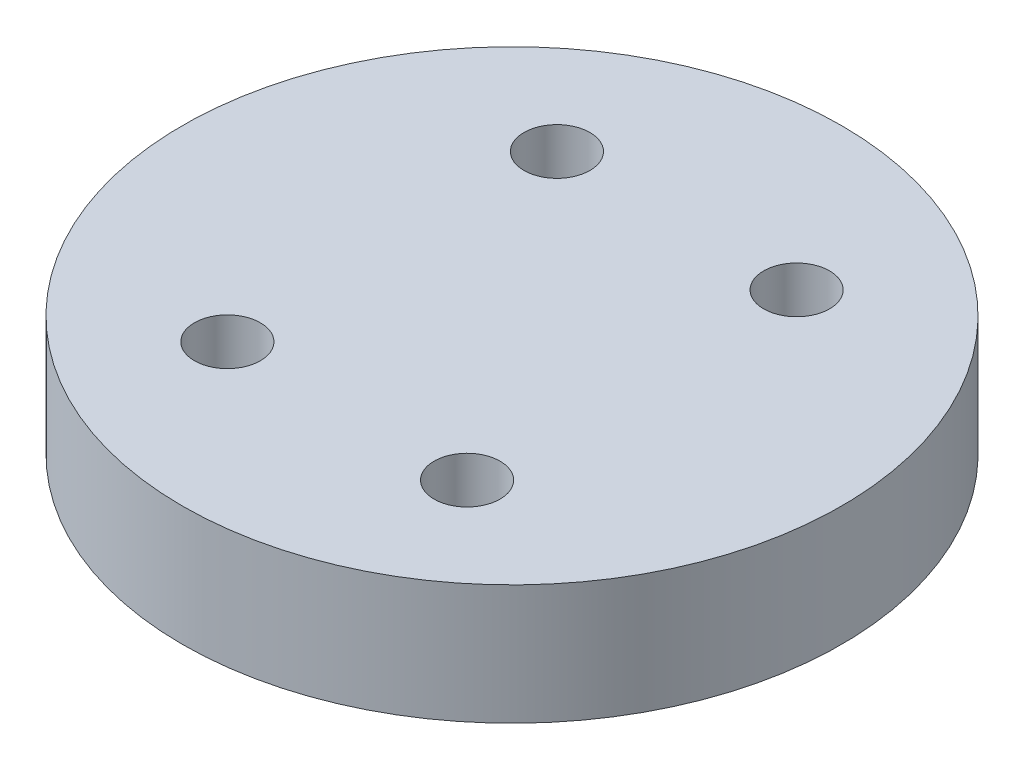
ISO-10303-21;
HEADER;
FILE_DESCRIPTION(('STEP AP214'),'2;1');
FILE_NAME('part.step','',(''),(''),'','','');
FILE_SCHEMA(('AUTOMOTIVE_DESIGN { 1 0 10303 214 1 1 1 1 }'));
ENDSEC;
DATA;
#1=APPLICATION_CONTEXT('core data for automotive mechanical design processes');
#2=APPLICATION_PROTOCOL_DEFINITION('international standard','automotive_design',2000,#1);
#3=PRODUCT_CONTEXT('',#1,'mechanical');
#4=PRODUCT('Part','Part','',(#3));
#5=PRODUCT_RELATED_PRODUCT_CATEGORY('part','',(#4));
#6=PRODUCT_DEFINITION_FORMATION('','',#4);
#7=PRODUCT_DEFINITION_CONTEXT('part definition',#1,'design');
#8=PRODUCT_DEFINITION('design','',#6,#7);
#9=PRODUCT_DEFINITION_SHAPE('','',#8);
#10=(LENGTH_UNIT() NAMED_UNIT(*) SI_UNIT(.MILLI.,.METRE.));
#11=(NAMED_UNIT(*) PLANE_ANGLE_UNIT() SI_UNIT($,.RADIAN.));
#12=(NAMED_UNIT(*) SI_UNIT($,.STERADIAN.) SOLID_ANGLE_UNIT());
#13=UNCERTAINTY_MEASURE_WITH_UNIT(LENGTH_MEASURE(1.E-05),#10,'distance_accuracy_value','');
#14=(GEOMETRIC_REPRESENTATION_CONTEXT(3) GLOBAL_UNCERTAINTY_ASSIGNED_CONTEXT((#13)) GLOBAL_UNIT_ASSIGNED_CONTEXT((#10,
#11,#12)) REPRESENTATION_CONTEXT('',''));
#15=CARTESIAN_POINT('',(0.,0.,0.));
#16=DIRECTION('',(0.,0.,1.));
#17=DIRECTION('',(1.,0.,0.));
#18=AXIS2_PLACEMENT_3D('',#15,#16,#17);
#19=CARTESIAN_POINT('',(10.,10.,13.75));
#20=DIRECTION('',(0.,-1.,0.));
#21=DIRECTION('',(0.,0.,-1.));
#22=AXIS2_PLACEMENT_3D('',#19,#20,#21);
#23=CYLINDRICAL_SURFACE('',#22,2.74999999999999);
#24=CARTESIAN_POINT('',(10.,10.,13.75));
#25=DIRECTION('',(0.,1.,0.));
#26=DIRECTION('',(0.,0.,1.));
#27=AXIS2_PLACEMENT_3D('',#24,#25,#26);
#28=CIRCLE('',#27,2.74999999999999);
#29=CARTESIAN_POINT('',(10.,10.,16.5));
#30=VERTEX_POINT('',#29);
#31=EDGE_CURVE('E43',#30,#30,#28,.T.);
#32=ORIENTED_EDGE('',*,*,#31,.T.);
#33=EDGE_LOOP('',(#32));
#34=FACE_BOUND('',#33,.T.);
#35=CARTESIAN_POINT('',(10.,0.,13.75));
#36=DIRECTION('',(0.,1.,0.));
#37=DIRECTION('',(0.,0.,1.));
#38=AXIS2_PLACEMENT_3D('',#35,#36,#37);
#39=CIRCLE('',#38,2.74999999999999);
#40=CARTESIAN_POINT('',(10.,0.,16.5));
#41=VERTEX_POINT('',#40);
#42=EDGE_CURVE('E60',#41,#41,#39,.T.);
#43=ORIENTED_EDGE('',*,*,#42,.F.);
#44=EDGE_LOOP('',(#43));
#45=FACE_BOUND('',#44,.T.);
#46=ADVANCED_FACE('F35',(#34,#45),#23,.F.);
#47=CARTESIAN_POINT('',(10.,10.,-13.75));
#48=DIRECTION('',(0.,-1.,0.));
#49=DIRECTION('',(0.,0.,-1.));
#50=AXIS2_PLACEMENT_3D('',#47,#48,#49);
#51=CYLINDRICAL_SURFACE('',#50,2.75);
#52=CARTESIAN_POINT('',(10.,10.,-13.75));
#53=DIRECTION('',(0.,1.,0.));
#54=DIRECTION('',(0.,0.,1.));
#55=AXIS2_PLACEMENT_3D('',#52,#53,#54);
#56=CIRCLE('',#55,2.75);
#57=CARTESIAN_POINT('',(10.,10.,-11.));
#58=VERTEX_POINT('',#57);
#59=EDGE_CURVE('E48',#58,#58,#56,.T.);
#60=ORIENTED_EDGE('',*,*,#59,.T.);
#61=EDGE_LOOP('',(#60));
#62=FACE_BOUND('',#61,.T.);
#63=CARTESIAN_POINT('',(10.,0.,-13.75));
#64=DIRECTION('',(0.,1.,0.));
#65=DIRECTION('',(0.,0.,1.));
#66=AXIS2_PLACEMENT_3D('',#63,#64,#65);
#67=CIRCLE('',#66,2.75);
#68=CARTESIAN_POINT('',(10.,0.,-11.));
#69=VERTEX_POINT('',#68);
#70=EDGE_CURVE('E58',#69,#69,#67,.T.);
#71=ORIENTED_EDGE('',*,*,#70,.F.);
#72=EDGE_LOOP('',(#71));
#73=FACE_BOUND('',#72,.T.);
#74=ADVANCED_FACE('F78',(#62,#73),#51,.F.);
#75=CARTESIAN_POINT('',(-10.,10.,13.75));
#76=DIRECTION('',(0.,-1.,0.));
#77=DIRECTION('',(0.,0.,-1.));
#78=AXIS2_PLACEMENT_3D('',#75,#76,#77);
#79=CYLINDRICAL_SURFACE('',#78,2.75);
#80=CARTESIAN_POINT('',(-10.,10.,13.75));
#81=DIRECTION('',(0.,1.,0.));
#82=DIRECTION('',(0.,0.,1.));
#83=AXIS2_PLACEMENT_3D('',#80,#81,#82);
#84=CIRCLE('',#83,2.75);
#85=CARTESIAN_POINT('',(-10.,10.,16.5));
#86=VERTEX_POINT('',#85);
#87=EDGE_CURVE('E69',#86,#86,#84,.T.);
#88=ORIENTED_EDGE('',*,*,#87,.T.);
#89=EDGE_LOOP('',(#88));
#90=FACE_BOUND('',#89,.T.);
#91=CARTESIAN_POINT('',(-10.,0.,13.75));
#92=DIRECTION('',(0.,1.,0.));
#93=DIRECTION('',(0.,0.,1.));
#94=AXIS2_PLACEMENT_3D('',#91,#92,#93);
#95=CIRCLE('',#94,2.75);
#96=CARTESIAN_POINT('',(-10.,0.,16.5));
#97=VERTEX_POINT('',#96);
#98=EDGE_CURVE('E55',#97,#97,#95,.T.);
#99=ORIENTED_EDGE('',*,*,#98,.F.);
#100=EDGE_LOOP('',(#99));
#101=FACE_BOUND('',#100,.T.);
#102=ADVANCED_FACE('F96',(#90,#101),#79,.F.);
#103=CARTESIAN_POINT('',(-10.,10.,-13.75));
#104=DIRECTION('',(0.,-1.,0.));
#105=DIRECTION('',(0.,0.,-1.));
#106=AXIS2_PLACEMENT_3D('',#103,#104,#105);
#107=CYLINDRICAL_SURFACE('',#106,2.75000000000001);
#108=CARTESIAN_POINT('',(-10.,10.,-13.75));
#109=DIRECTION('',(0.,1.,0.));
#110=DIRECTION('',(0.,0.,1.));
#111=AXIS2_PLACEMENT_3D('',#108,#109,#110);
#112=CIRCLE('',#111,2.75000000000001);
#113=CARTESIAN_POINT('',(-10.,10.,-11.));
#114=VERTEX_POINT('',#113);
#115=EDGE_CURVE('E65',#114,#114,#112,.T.);
#116=ORIENTED_EDGE('',*,*,#115,.T.);
#117=EDGE_LOOP('',(#116));
#118=FACE_BOUND('',#117,.T.);
#119=CARTESIAN_POINT('',(-10.,0.,-13.75));
#120=DIRECTION('',(0.,1.,0.));
#121=DIRECTION('',(0.,0.,1.));
#122=AXIS2_PLACEMENT_3D('',#119,#120,#121);
#123=CIRCLE('',#122,2.75000000000001);
#124=CARTESIAN_POINT('',(-10.,0.,-11.));
#125=VERTEX_POINT('',#124);
#126=EDGE_CURVE('E52',#125,#125,#123,.T.);
#127=ORIENTED_EDGE('',*,*,#126,.F.);
#128=EDGE_LOOP('',(#127));
#129=FACE_BOUND('',#128,.T.);
#130=ADVANCED_FACE('F37',(#118,#129),#107,.F.);
#131=CARTESIAN_POINT('',(0.,10.,0.));
#132=DIRECTION('',(0.,-1.,0.));
#133=DIRECTION('',(0.,0.,-1.));
#134=AXIS2_PLACEMENT_3D('',#131,#132,#133);
#135=CYLINDRICAL_SURFACE('',#134,27.5);
#136=CARTESIAN_POINT('',(0.,10.,0.));
#137=DIRECTION('',(0.,1.,0.));
#138=DIRECTION('',(0.,0.,1.));
#139=AXIS2_PLACEMENT_3D('',#136,#137,#138);
#140=CIRCLE('',#139,27.5);
#141=CARTESIAN_POINT('',(0.,10.,27.5));
#142=VERTEX_POINT('',#141);
#143=EDGE_CURVE('E10',#142,#142,#140,.T.);
#144=ORIENTED_EDGE('',*,*,#143,.F.);
#145=EDGE_LOOP('',(#144));
#146=FACE_BOUND('',#145,.T.);
#147=CARTESIAN_POINT('',(0.,0.,0.));
#148=DIRECTION('',(0.,1.,0.));
#149=DIRECTION('',(0.,0.,1.));
#150=AXIS2_PLACEMENT_3D('',#147,#148,#149);
#151=CIRCLE('',#150,27.5);
#152=CARTESIAN_POINT('',(0.,0.,27.5));
#153=VERTEX_POINT('',#152);
#154=EDGE_CURVE('E39',#153,#153,#151,.T.);
#155=ORIENTED_EDGE('',*,*,#154,.T.);
#156=EDGE_LOOP('',(#155));
#157=FACE_BOUND('',#156,.T.);
#158=ADVANCED_FACE('F85',(#146,#157),#135,.T.);
#159=CARTESIAN_POINT('',(0.,10.,0.));
#160=DIRECTION('',(0.,1.,0.));
#161=DIRECTION('',(0.,0.,1.));
#162=AXIS2_PLACEMENT_3D('',#159,#160,#161);
#163=PLANE('',#162);
#164=ORIENTED_EDGE('',*,*,#115,.F.);
#165=EDGE_LOOP('',(#164));
#166=FACE_BOUND('',#165,.T.);
#167=ORIENTED_EDGE('',*,*,#87,.F.);
#168=EDGE_LOOP('',(#167));
#169=FACE_BOUND('',#168,.T.);
#170=ORIENTED_EDGE('',*,*,#59,.F.);
#171=EDGE_LOOP('',(#170));
#172=FACE_BOUND('',#171,.T.);
#173=ORIENTED_EDGE('',*,*,#31,.F.);
#174=EDGE_LOOP('',(#173));
#175=FACE_BOUND('',#174,.T.);
#176=ORIENTED_EDGE('',*,*,#143,.T.);
#177=EDGE_LOOP('',(#176));
#178=FACE_BOUND('',#177,.T.);
#179=ADVANCED_FACE('F81',(#166,#169,#172,#175,#178),#163,.T.);
#180=CARTESIAN_POINT('',(0.,0.,0.));
#181=DIRECTION('',(0.,1.,0.));
#182=DIRECTION('',(0.,0.,1.));
#183=AXIS2_PLACEMENT_3D('',#180,#181,#182);
#184=PLANE('',#183);
#185=ORIENTED_EDGE('',*,*,#126,.T.);
#186=EDGE_LOOP('',(#185));
#187=FACE_BOUND('',#186,.T.);
#188=ORIENTED_EDGE('',*,*,#98,.T.);
#189=EDGE_LOOP('',(#188));
#190=FACE_BOUND('',#189,.T.);
#191=ORIENTED_EDGE('',*,*,#70,.T.);
#192=EDGE_LOOP('',(#191));
#193=FACE_BOUND('',#192,.T.);
#194=ORIENTED_EDGE('',*,*,#42,.T.);
#195=EDGE_LOOP('',(#194));
#196=FACE_BOUND('',#195,.T.);
#197=ORIENTED_EDGE('',*,*,#154,.F.);
#198=EDGE_LOOP('',(#197));
#199=FACE_BOUND('',#198,.T.);
#200=ADVANCED_FACE('F84',(#187,#190,#193,#196,#199),#184,.F.);
#201=CLOSED_SHELL('',(#46,#74,#102,#130,#158,#179,#200));
#202=MANIFOLD_SOLID_BREP('B2',#201);
#203=ADVANCED_BREP_SHAPE_REPRESENTATION('',(#18,#202),#14);
#204=SHAPE_DEFINITION_REPRESENTATION(#9,#203);
ENDSEC;
END-ISO-10303-21;
